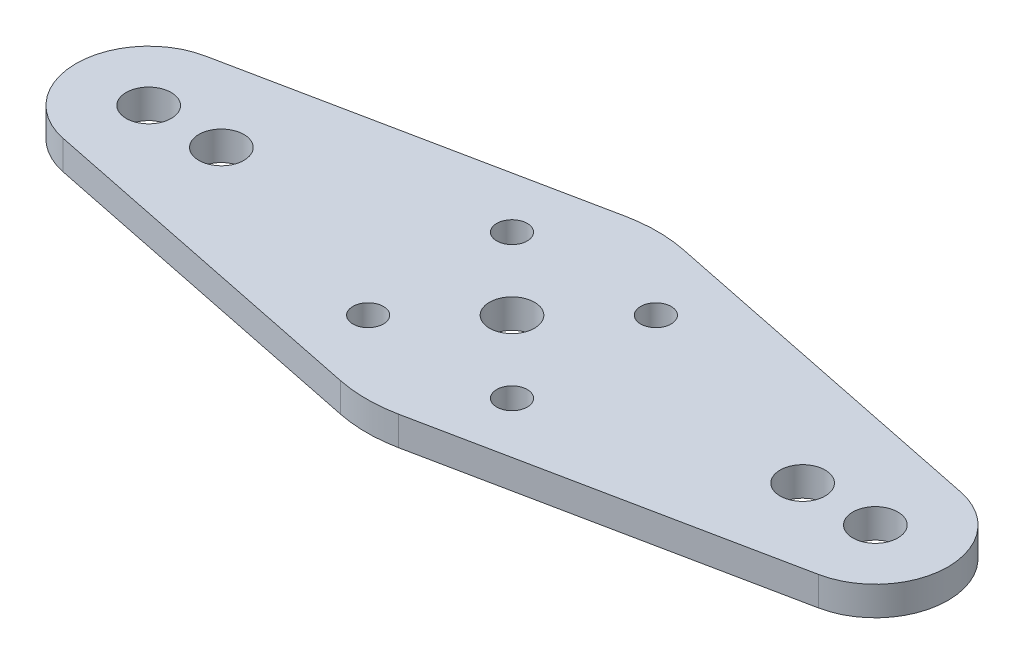
ISO-10303-21;
HEADER;
FILE_DESCRIPTION(('STEP AP214'),'2;1');
FILE_NAME('part.step','',(''),(''),'','','');
FILE_SCHEMA(('AUTOMOTIVE_DESIGN { 1 0 10303 214 1 1 1 1 }'));
ENDSEC;
DATA;
#1=APPLICATION_CONTEXT('core data for automotive mechanical design processes');
#2=APPLICATION_PROTOCOL_DEFINITION('international standard','automotive_design',2000,#1);
#3=PRODUCT_CONTEXT('',#1,'mechanical');
#4=PRODUCT('Part','Part','',(#3));
#5=PRODUCT_RELATED_PRODUCT_CATEGORY('part','',(#4));
#6=PRODUCT_DEFINITION_FORMATION('','',#4);
#7=PRODUCT_DEFINITION_CONTEXT('part definition',#1,'design');
#8=PRODUCT_DEFINITION('design','',#6,#7);
#9=PRODUCT_DEFINITION_SHAPE('','',#8);
#10=(LENGTH_UNIT() NAMED_UNIT(*) SI_UNIT(.MILLI.,.METRE.));
#11=(NAMED_UNIT(*) PLANE_ANGLE_UNIT() SI_UNIT($,.RADIAN.));
#12=(NAMED_UNIT(*) SI_UNIT($,.STERADIAN.) SOLID_ANGLE_UNIT());
#13=UNCERTAINTY_MEASURE_WITH_UNIT(LENGTH_MEASURE(1.E-05),#10,'distance_accuracy_value','');
#14=(GEOMETRIC_REPRESENTATION_CONTEXT(3) GLOBAL_UNCERTAINTY_ASSIGNED_CONTEXT((#13)) GLOBAL_UNIT_ASSIGNED_CONTEXT((#10,
#11,#12)) REPRESENTATION_CONTEXT('',''));
#15=CARTESIAN_POINT('',(0.,0.,0.));
#16=DIRECTION('',(0.,0.,1.));
#17=DIRECTION('',(1.,0.,0.));
#18=AXIS2_PLACEMENT_3D('',#15,#16,#17);
#19=CARTESIAN_POINT('',(0.,-4.,0.));
#20=DIRECTION('',(0.,1.,0.));
#21=DIRECTION('',(0.,0.,1.));
#22=AXIS2_PLACEMENT_3D('',#19,#20,#21);
#23=CYLINDRICAL_SURFACE('',#22,20.);
#24=CARTESIAN_POINT('',(0.,0.,0.));
#25=DIRECTION('',(0.,1.,0.));
#26=DIRECTION('',(0.,0.,1.));
#27=AXIS2_PLACEMENT_3D('',#24,#25,#26);
#28=CIRCLE('',#27,20.);
#29=CARTESIAN_POINT('',(-3.99999999999999,0.,19.5959179422654));
#30=VERTEX_POINT('',#29);
#31=CARTESIAN_POINT('',(4.,0.,19.5959179422654));
#32=VERTEX_POINT('',#31);
#33=EDGE_CURVE('E140',#30,#32,#28,.T.);
#34=ORIENTED_EDGE('',*,*,#33,.F.);
#35=DIRECTION('',(0.,1.,0.));
#36=VECTOR('',#35,1.);
#37=CARTESIAN_POINT('',(-3.99999999999999,-4.,19.5959179422654));
#38=LINE('',#37,#36);
#39=CARTESIAN_POINT('',(-3.99999999999999,-4.,19.5959179422654));
#40=VERTEX_POINT('',#39);
#41=EDGE_CURVE('E11',#40,#30,#38,.T.);
#42=ORIENTED_EDGE('',*,*,#41,.F.);
#43=CARTESIAN_POINT('',(0.,-4.,0.));
#44=DIRECTION('',(0.,1.,0.));
#45=DIRECTION('',(0.,0.,1.));
#46=AXIS2_PLACEMENT_3D('',#43,#44,#45);
#47=CIRCLE('',#46,20.);
#48=CARTESIAN_POINT('',(4.,-4.,19.5959179422654));
#49=VERTEX_POINT('',#48);
#50=EDGE_CURVE('E161',#40,#49,#47,.T.);
#51=ORIENTED_EDGE('',*,*,#50,.T.);
#52=DIRECTION('',(0.,1.,0.));
#53=VECTOR('',#52,1.);
#54=CARTESIAN_POINT('',(4.,-4.,19.5959179422654));
#55=LINE('',#54,#53);
#56=EDGE_CURVE('E46',#49,#32,#55,.T.);
#57=ORIENTED_EDGE('',*,*,#56,.T.);
#58=EDGE_LOOP('',(#34,#42,#51,#57));
#59=FACE_BOUND('',#58,.T.);
#60=ADVANCED_FACE('F43',(#59),#23,.T.);
#61=CARTESIAN_POINT('',(-3.99999999999999,-4.,19.5959179422654));
#62=DIRECTION('',(-0.2,0.,0.979795897113271));
#63=DIRECTION('',(0.979795897113271,0.,0.2));
#64=AXIS2_PLACEMENT_3D('',#61,#62,#63);
#65=PLANE('',#64);
#66=DIRECTION('',(0.979795897113271,0.,0.2));
#67=VECTOR('',#66,1.);
#68=CARTESIAN_POINT('',(-3.99999999999999,0.,19.5959179422654));
#69=LINE('',#68,#67);
#70=CARTESIAN_POINT('',(-52.,0.,9.79795897113274));
#71=VERTEX_POINT('',#70);
#72=EDGE_CURVE('E159',#71,#30,#69,.T.);
#73=ORIENTED_EDGE('',*,*,#72,.F.);
#74=DIRECTION('',(0.,1.,0.));
#75=VECTOR('',#74,1.);
#76=CARTESIAN_POINT('',(-52.,-4.,9.79795897113274));
#77=LINE('',#76,#75);
#78=CARTESIAN_POINT('',(-52.,-4.,9.79795897113274));
#79=VERTEX_POINT('',#78);
#80=EDGE_CURVE('E52',#79,#71,#77,.T.);
#81=ORIENTED_EDGE('',*,*,#80,.F.);
#82=DIRECTION('',(0.979795897113271,0.,0.2));
#83=VECTOR('',#82,1.);
#84=CARTESIAN_POINT('',(-3.99999999999999,-4.,19.5959179422654));
#85=LINE('',#84,#83);
#86=EDGE_CURVE('E130',#79,#40,#85,.T.);
#87=ORIENTED_EDGE('',*,*,#86,.T.);
#88=ORIENTED_EDGE('',*,*,#41,.T.);
#89=EDGE_LOOP('',(#73,#81,#87,#88));
#90=FACE_BOUND('',#89,.T.);
#91=ADVANCED_FACE('F173',(#90),#65,.T.);
#92=CARTESIAN_POINT('',(-50.,-4.,0.));
#93=DIRECTION('',(0.,1.,0.));
#94=DIRECTION('',(0.,0.,1.));
#95=AXIS2_PLACEMENT_3D('',#92,#93,#94);
#96=CYLINDRICAL_SURFACE('',#95,10.);
#97=CARTESIAN_POINT('',(-50.,0.,0.));
#98=DIRECTION('',(0.,1.,0.));
#99=DIRECTION('',(0.,0.,1.));
#100=AXIS2_PLACEMENT_3D('',#97,#98,#99);
#101=CIRCLE('',#100,10.);
#102=CARTESIAN_POINT('',(-52.,0.,-9.79795897113273));
#103=VERTEX_POINT('',#102);
#104=EDGE_CURVE('E117',#103,#71,#101,.T.);
#105=ORIENTED_EDGE('',*,*,#104,.F.);
#106=DIRECTION('',(0.,1.,0.));
#107=VECTOR('',#106,1.);
#108=CARTESIAN_POINT('',(-52.,-4.,-9.79795897113273));
#109=LINE('',#108,#107);
#110=CARTESIAN_POINT('',(-52.,-4.,-9.79795897113273));
#111=VERTEX_POINT('',#110);
#112=EDGE_CURVE('E112',#111,#103,#109,.T.);
#113=ORIENTED_EDGE('',*,*,#112,.F.);
#114=CARTESIAN_POINT('',(-50.,-4.,0.));
#115=DIRECTION('',(0.,1.,0.));
#116=DIRECTION('',(0.,0.,1.));
#117=AXIS2_PLACEMENT_3D('',#114,#115,#116);
#118=CIRCLE('',#117,10.);
#119=EDGE_CURVE('E115',#111,#79,#118,.T.);
#120=ORIENTED_EDGE('',*,*,#119,.T.);
#121=ORIENTED_EDGE('',*,*,#80,.T.);
#122=EDGE_LOOP('',(#105,#113,#120,#121));
#123=FACE_BOUND('',#122,.T.);
#124=ADVANCED_FACE('F114',(#123),#96,.T.);
#125=CARTESIAN_POINT('',(-52.,-4.,-9.79795897113273));
#126=DIRECTION('',(-0.2,0.,-0.979795897113271));
#127=DIRECTION('',(-0.979795897113271,0.,0.2));
#128=AXIS2_PLACEMENT_3D('',#125,#126,#127);
#129=PLANE('',#128);
#130=DIRECTION('',(-0.979795897113271,0.,0.2));
#131=VECTOR('',#130,1.);
#132=CARTESIAN_POINT('',(-52.,0.,-9.79795897113273));
#133=LINE('',#132,#131);
#134=CARTESIAN_POINT('',(-3.99999999999999,0.,-19.5959179422654));
#135=VERTEX_POINT('',#134);
#136=EDGE_CURVE('E156',#135,#103,#133,.T.);
#137=ORIENTED_EDGE('',*,*,#136,.F.);
#138=DIRECTION('',(0.,1.,0.));
#139=VECTOR('',#138,1.);
#140=CARTESIAN_POINT('',(-3.99999999999999,-4.,-19.5959179422654));
#141=LINE('',#140,#139);
#142=CARTESIAN_POINT('',(-3.99999999999999,-4.,-19.5959179422654));
#143=VERTEX_POINT('',#142);
#144=EDGE_CURVE('E122',#143,#135,#141,.T.);
#145=ORIENTED_EDGE('',*,*,#144,.F.);
#146=DIRECTION('',(-0.979795897113271,0.,0.2));
#147=VECTOR('',#146,1.);
#148=CARTESIAN_POINT('',(-52.,-4.,-9.79795897113273));
#149=LINE('',#148,#147);
#150=EDGE_CURVE('E128',#143,#111,#149,.T.);
#151=ORIENTED_EDGE('',*,*,#150,.T.);
#152=ORIENTED_EDGE('',*,*,#112,.T.);
#153=EDGE_LOOP('',(#137,#145,#151,#152));
#154=FACE_BOUND('',#153,.T.);
#155=ADVANCED_FACE('F132',(#154),#129,.T.);
#156=CARTESIAN_POINT('',(0.,-4.,0.));
#157=DIRECTION('',(0.,1.,0.));
#158=DIRECTION('',(0.,0.,1.));
#159=AXIS2_PLACEMENT_3D('',#156,#157,#158);
#160=CYLINDRICAL_SURFACE('',#159,20.);
#161=CARTESIAN_POINT('',(0.,0.,0.));
#162=DIRECTION('',(0.,1.,0.));
#163=DIRECTION('',(0.,0.,1.));
#164=AXIS2_PLACEMENT_3D('',#161,#162,#163);
#165=CIRCLE('',#164,20.);
#166=CARTESIAN_POINT('',(4.,0.,-19.5959179422654));
#167=VERTEX_POINT('',#166);
#168=EDGE_CURVE('E153',#167,#135,#165,.T.);
#169=ORIENTED_EDGE('',*,*,#168,.F.);
#170=DIRECTION('',(0.,1.,0.));
#171=VECTOR('',#170,1.);
#172=CARTESIAN_POINT('',(4.,-4.,-19.5959179422654));
#173=LINE('',#172,#171);
#174=CARTESIAN_POINT('',(4.,-4.,-19.5959179422654));
#175=VERTEX_POINT('',#174);
#176=EDGE_CURVE('E165',#175,#167,#173,.T.);
#177=ORIENTED_EDGE('',*,*,#176,.F.);
#178=CARTESIAN_POINT('',(0.,-4.,0.));
#179=DIRECTION('',(0.,1.,0.));
#180=DIRECTION('',(0.,0.,1.));
#181=AXIS2_PLACEMENT_3D('',#178,#179,#180);
#182=CIRCLE('',#181,20.);
#183=EDGE_CURVE('E133',#175,#143,#182,.T.);
#184=ORIENTED_EDGE('',*,*,#183,.T.);
#185=ORIENTED_EDGE('',*,*,#144,.T.);
#186=EDGE_LOOP('',(#169,#177,#184,#185));
#187=FACE_BOUND('',#186,.T.);
#188=ADVANCED_FACE('F186',(#187),#160,.T.);
#189=CARTESIAN_POINT('',(4.,-4.,-19.5959179422654));
#190=DIRECTION('',(0.2,0.,-0.979795897113271));
#191=DIRECTION('',(-0.979795897113271,0.,-0.2));
#192=AXIS2_PLACEMENT_3D('',#189,#190,#191);
#193=PLANE('',#192);
#194=DIRECTION('',(-0.979795897113271,0.,-0.2));
#195=VECTOR('',#194,1.);
#196=CARTESIAN_POINT('',(4.,0.,-19.5959179422654));
#197=LINE('',#196,#195);
#198=CARTESIAN_POINT('',(52.,0.,-9.79795897113273));
#199=VERTEX_POINT('',#198);
#200=EDGE_CURVE('E150',#199,#167,#197,.T.);
#201=ORIENTED_EDGE('',*,*,#200,.F.);
#202=DIRECTION('',(0.,1.,0.));
#203=VECTOR('',#202,1.);
#204=CARTESIAN_POINT('',(52.,-4.,-9.79795897113273));
#205=LINE('',#204,#203);
#206=CARTESIAN_POINT('',(52.,-4.,-9.79795897113273));
#207=VERTEX_POINT('',#206);
#208=EDGE_CURVE('E167',#207,#199,#205,.T.);
#209=ORIENTED_EDGE('',*,*,#208,.F.);
#210=DIRECTION('',(-0.979795897113271,0.,-0.2));
#211=VECTOR('',#210,1.);
#212=CARTESIAN_POINT('',(4.,-4.,-19.5959179422654));
#213=LINE('',#212,#211);
#214=EDGE_CURVE('E135',#207,#175,#213,.T.);
#215=ORIENTED_EDGE('',*,*,#214,.T.);
#216=ORIENTED_EDGE('',*,*,#176,.T.);
#217=EDGE_LOOP('',(#201,#209,#215,#216));
#218=FACE_BOUND('',#217,.T.);
#219=ADVANCED_FACE('F189',(#218),#193,.T.);
#220=CARTESIAN_POINT('',(50.,-4.,0.));
#221=DIRECTION('',(0.,1.,0.));
#222=DIRECTION('',(0.,0.,1.));
#223=AXIS2_PLACEMENT_3D('',#220,#221,#222);
#224=CYLINDRICAL_SURFACE('',#223,10.);
#225=CARTESIAN_POINT('',(50.,0.,0.));
#226=DIRECTION('',(0.,1.,0.));
#227=DIRECTION('',(0.,0.,1.));
#228=AXIS2_PLACEMENT_3D('',#225,#226,#227);
#229=CIRCLE('',#228,10.);
#230=CARTESIAN_POINT('',(52.,0.,9.79795897113273));
#231=VERTEX_POINT('',#230);
#232=EDGE_CURVE('E147',#231,#199,#229,.T.);
#233=ORIENTED_EDGE('',*,*,#232,.F.);
#234=DIRECTION('',(0.,1.,0.));
#235=VECTOR('',#234,1.);
#236=CARTESIAN_POINT('',(52.,-4.,9.79795897113273));
#237=LINE('',#236,#235);
#238=CARTESIAN_POINT('',(52.,-4.,9.79795897113273));
#239=VERTEX_POINT('',#238);
#240=EDGE_CURVE('E168',#239,#231,#237,.T.);
#241=ORIENTED_EDGE('',*,*,#240,.F.);
#242=CARTESIAN_POINT('',(50.,-4.,0.));
#243=DIRECTION('',(0.,1.,0.));
#244=DIRECTION('',(0.,0.,1.));
#245=AXIS2_PLACEMENT_3D('',#242,#243,#244);
#246=CIRCLE('',#245,10.);
#247=EDGE_CURVE('E305',#239,#207,#246,.T.);
#248=ORIENTED_EDGE('',*,*,#247,.T.);
#249=ORIENTED_EDGE('',*,*,#208,.T.);
#250=EDGE_LOOP('',(#233,#241,#248,#249));
#251=FACE_BOUND('',#250,.T.);
#252=ADVANCED_FACE('F193',(#251),#224,.T.);
#253=CARTESIAN_POINT('',(52.,-4.,9.79795897113273));
#254=DIRECTION('',(0.2,0.,0.979795897113271));
#255=DIRECTION('',(0.979795897113271,0.,-0.2));
#256=AXIS2_PLACEMENT_3D('',#253,#254,#255);
#257=PLANE('',#256);
#258=DIRECTION('',(0.979795897113271,0.,-0.2));
#259=VECTOR('',#258,1.);
#260=CARTESIAN_POINT('',(52.,0.,9.79795897113273));
#261=LINE('',#260,#259);
#262=EDGE_CURVE('E143',#32,#231,#261,.T.);
#263=ORIENTED_EDGE('',*,*,#262,.F.);
#264=ORIENTED_EDGE('',*,*,#56,.F.);
#265=DIRECTION('',(0.979795897113271,0.,-0.2));
#266=VECTOR('',#265,1.);
#267=CARTESIAN_POINT('',(52.,-4.,9.79795897113273));
#268=LINE('',#267,#266);
#269=EDGE_CURVE('E303',#49,#239,#268,.T.);
#270=ORIENTED_EDGE('',*,*,#269,.T.);
#271=ORIENTED_EDGE('',*,*,#240,.T.);
#272=EDGE_LOOP('',(#263,#264,#270,#271));
#273=FACE_BOUND('',#272,.T.);
#274=ADVANCED_FACE('F170',(#273),#257,.T.);
#275=CARTESIAN_POINT('',(0.,-4.,0.));
#276=DIRECTION('',(0.,1.,0.));
#277=DIRECTION('',(0.,0.,1.));
#278=AXIS2_PLACEMENT_3D('',#275,#276,#277);
#279=PLANE('',#278);
#280=CARTESIAN_POINT('',(0.,-4.,0.));
#281=DIRECTION('',(0.,1.,0.));
#282=DIRECTION('',(0.,0.,1.));
#283=AXIS2_PLACEMENT_3D('',#280,#281,#282);
#284=CIRCLE('',#283,3.1);
#285=CARTESIAN_POINT('',(0.,-4.,3.1));
#286=VERTEX_POINT('',#285);
#287=EDGE_CURVE('E251',#286,#286,#284,.T.);
#288=ORIENTED_EDGE('',*,*,#287,.T.);
#289=EDGE_LOOP('',(#288));
#290=FACE_BOUND('',#289,.T.);
#291=CARTESIAN_POINT('',(40.,-4.,0.));
#292=DIRECTION('',(0.,1.,0.));
#293=DIRECTION('',(0.,0.,1.));
#294=AXIS2_PLACEMENT_3D('',#291,#292,#293);
#295=CIRCLE('',#294,3.1);
#296=CARTESIAN_POINT('',(40.,-4.,3.1));
#297=VERTEX_POINT('',#296);
#298=EDGE_CURVE('E255',#297,#297,#295,.T.);
#299=ORIENTED_EDGE('',*,*,#298,.T.);
#300=EDGE_LOOP('',(#299));
#301=FACE_BOUND('',#300,.T.);
#302=CARTESIAN_POINT('',(-50.,-4.,0.));
#303=DIRECTION('',(0.,1.,0.));
#304=DIRECTION('',(0.,0.,1.));
#305=AXIS2_PLACEMENT_3D('',#302,#303,#304);
#306=CIRCLE('',#305,3.1);
#307=CARTESIAN_POINT('',(-50.,-4.,3.1));
#308=VERTEX_POINT('',#307);
#309=EDGE_CURVE('E262',#308,#308,#306,.T.);
#310=ORIENTED_EDGE('',*,*,#309,.T.);
#311=EDGE_LOOP('',(#310));
#312=FACE_BOUND('',#311,.T.);
#313=CARTESIAN_POINT('',(-9.89949493661197,-4.,-9.89949493661137));
#314=DIRECTION('',(0.,1.,0.));
#315=DIRECTION('',(0.,0.,1.));
#316=AXIS2_PLACEMENT_3D('',#313,#314,#315);
#317=CIRCLE('',#316,2.1);
#318=CARTESIAN_POINT('',(-9.89949493661197,-4.,-7.79949493661137));
#319=VERTEX_POINT('',#318);
#320=EDGE_CURVE('E268',#319,#319,#317,.T.);
#321=ORIENTED_EDGE('',*,*,#320,.T.);
#322=EDGE_LOOP('',(#321));
#323=FACE_BOUND('',#322,.T.);
#324=CARTESIAN_POINT('',(-9.89949493661137,-4.,9.89949493661197));
#325=DIRECTION('',(0.,1.,0.));
#326=DIRECTION('',(0.,0.,1.));
#327=AXIS2_PLACEMENT_3D('',#324,#325,#326);
#328=CIRCLE('',#327,2.1);
#329=CARTESIAN_POINT('',(-9.89949493661137,-4.,11.999494936612));
#330=VERTEX_POINT('',#329);
#331=EDGE_CURVE('E274',#330,#330,#328,.T.);
#332=ORIENTED_EDGE('',*,*,#331,.T.);
#333=EDGE_LOOP('',(#332));
#334=FACE_BOUND('',#333,.T.);
#335=CARTESIAN_POINT('',(9.89949493661196,-4.,9.89949493661137));
#336=DIRECTION('',(0.,1.,0.));
#337=DIRECTION('',(0.,0.,1.));
#338=AXIS2_PLACEMENT_3D('',#335,#336,#337);
#339=CIRCLE('',#338,2.09999999999999);
#340=CARTESIAN_POINT('',(9.89949493661196,-4.,11.9994949366114));
#341=VERTEX_POINT('',#340);
#342=EDGE_CURVE('E280',#341,#341,#339,.T.);
#343=ORIENTED_EDGE('',*,*,#342,.T.);
#344=EDGE_LOOP('',(#343));
#345=FACE_BOUND('',#344,.T.);
#346=CARTESIAN_POINT('',(50.,-4.,0.));
#347=DIRECTION('',(0.,1.,0.));
#348=DIRECTION('',(0.,0.,1.));
#349=AXIS2_PLACEMENT_3D('',#346,#347,#348);
#350=CIRCLE('',#349,3.09999999999997);
#351=CARTESIAN_POINT('',(50.,-4.,3.09999999999997));
#352=VERTEX_POINT('',#351);
#353=EDGE_CURVE('E286',#352,#352,#350,.T.);
#354=ORIENTED_EDGE('',*,*,#353,.T.);
#355=EDGE_LOOP('',(#354));
#356=FACE_BOUND('',#355,.T.);
#357=CARTESIAN_POINT('',(9.89949493661137,-4.,-9.89949493661196));
#358=DIRECTION('',(0.,1.,0.));
#359=DIRECTION('',(0.,0.,1.));
#360=AXIS2_PLACEMENT_3D('',#357,#358,#359);
#361=CIRCLE('',#360,2.1);
#362=CARTESIAN_POINT('',(9.89949493661137,-4.,-7.79949493661197));
#363=VERTEX_POINT('',#362);
#364=EDGE_CURVE('E292',#363,#363,#361,.T.);
#365=ORIENTED_EDGE('',*,*,#364,.T.);
#366=EDGE_LOOP('',(#365));
#367=FACE_BOUND('',#366,.T.);
#368=CARTESIAN_POINT('',(-40.,-4.,0.));
#369=DIRECTION('',(0.,1.,0.));
#370=DIRECTION('',(0.,0.,1.));
#371=AXIS2_PLACEMENT_3D('',#368,#369,#370);
#372=CIRCLE('',#371,3.1);
#373=CARTESIAN_POINT('',(-40.,-4.,3.1));
#374=VERTEX_POINT('',#373);
#375=EDGE_CURVE('E144',#374,#374,#372,.T.);
#376=ORIENTED_EDGE('',*,*,#375,.T.);
#377=EDGE_LOOP('',(#376));
#378=FACE_BOUND('',#377,.T.);
#379=ORIENTED_EDGE('',*,*,#50,.F.);
#380=ORIENTED_EDGE('',*,*,#86,.F.);
#381=ORIENTED_EDGE('',*,*,#119,.F.);
#382=ORIENTED_EDGE('',*,*,#150,.F.);
#383=ORIENTED_EDGE('',*,*,#183,.F.);
#384=ORIENTED_EDGE('',*,*,#214,.F.);
#385=ORIENTED_EDGE('',*,*,#247,.F.);
#386=ORIENTED_EDGE('',*,*,#269,.F.);
#387=EDGE_LOOP('',(#379,#380,#381,#382,#383,#384,#385,#386));
#388=FACE_BOUND('',#387,.T.);
#389=ADVANCED_FACE('F126',(#290,#301,#312,#323,#334,#345,#356,#367,#378,#388),#279,.F.);
#390=CARTESIAN_POINT('',(0.,0.,0.));
#391=DIRECTION('',(0.,1.,0.));
#392=DIRECTION('',(0.,0.,1.));
#393=AXIS2_PLACEMENT_3D('',#390,#391,#392);
#394=PLANE('',#393);
#395=CARTESIAN_POINT('',(0.,0.,0.));
#396=DIRECTION('',(0.,1.,0.));
#397=DIRECTION('',(0.,0.,1.));
#398=AXIS2_PLACEMENT_3D('',#395,#396,#397);
#399=CIRCLE('',#398,3.1);
#400=CARTESIAN_POINT('',(0.,0.,3.1));
#401=VERTEX_POINT('',#400);
#402=EDGE_CURVE('E249',#401,#401,#399,.T.);
#403=ORIENTED_EDGE('',*,*,#402,.F.);
#404=EDGE_LOOP('',(#403));
#405=FACE_BOUND('',#404,.T.);
#406=CARTESIAN_POINT('',(40.,0.,0.));
#407=DIRECTION('',(0.,1.,0.));
#408=DIRECTION('',(0.,0.,1.));
#409=AXIS2_PLACEMENT_3D('',#406,#407,#408);
#410=CIRCLE('',#409,3.1);
#411=CARTESIAN_POINT('',(40.,0.,3.1));
#412=VERTEX_POINT('',#411);
#413=EDGE_CURVE('E252',#412,#412,#410,.T.);
#414=ORIENTED_EDGE('',*,*,#413,.F.);
#415=EDGE_LOOP('',(#414));
#416=FACE_BOUND('',#415,.T.);
#417=CARTESIAN_POINT('',(-50.,0.,0.));
#418=DIRECTION('',(0.,1.,0.));
#419=DIRECTION('',(0.,0.,1.));
#420=AXIS2_PLACEMENT_3D('',#417,#418,#419);
#421=CIRCLE('',#420,3.1);
#422=CARTESIAN_POINT('',(-50.,0.,3.1));
#423=VERTEX_POINT('',#422);
#424=EDGE_CURVE('E260',#423,#423,#421,.T.);
#425=ORIENTED_EDGE('',*,*,#424,.F.);
#426=EDGE_LOOP('',(#425));
#427=FACE_BOUND('',#426,.T.);
#428=CARTESIAN_POINT('',(-9.89949493661197,0.,-9.89949493661137));
#429=DIRECTION('',(0.,1.,0.));
#430=DIRECTION('',(0.,0.,1.));
#431=AXIS2_PLACEMENT_3D('',#428,#429,#430);
#432=CIRCLE('',#431,2.1);
#433=CARTESIAN_POINT('',(-9.89949493661197,0.,-7.79949493661137));
#434=VERTEX_POINT('',#433);
#435=EDGE_CURVE('E265',#434,#434,#432,.T.);
#436=ORIENTED_EDGE('',*,*,#435,.F.);
#437=EDGE_LOOP('',(#436));
#438=FACE_BOUND('',#437,.T.);
#439=CARTESIAN_POINT('',(-9.89949493661137,0.,9.89949493661197));
#440=DIRECTION('',(0.,1.,0.));
#441=DIRECTION('',(0.,0.,1.));
#442=AXIS2_PLACEMENT_3D('',#439,#440,#441);
#443=CIRCLE('',#442,2.1);
#444=CARTESIAN_POINT('',(-9.89949493661137,0.,11.999494936612));
#445=VERTEX_POINT('',#444);
#446=EDGE_CURVE('E271',#445,#445,#443,.T.);
#447=ORIENTED_EDGE('',*,*,#446,.F.);
#448=EDGE_LOOP('',(#447));
#449=FACE_BOUND('',#448,.T.);
#450=CARTESIAN_POINT('',(9.89949493661196,0.,9.89949493661137));
#451=DIRECTION('',(0.,1.,0.));
#452=DIRECTION('',(0.,0.,1.));
#453=AXIS2_PLACEMENT_3D('',#450,#451,#452);
#454=CIRCLE('',#453,2.09999999999999);
#455=CARTESIAN_POINT('',(9.89949493661196,0.,11.9994949366114));
#456=VERTEX_POINT('',#455);
#457=EDGE_CURVE('E277',#456,#456,#454,.T.);
#458=ORIENTED_EDGE('',*,*,#457,.F.);
#459=EDGE_LOOP('',(#458));
#460=FACE_BOUND('',#459,.T.);
#461=CARTESIAN_POINT('',(50.,0.,0.));
#462=DIRECTION('',(0.,1.,0.));
#463=DIRECTION('',(0.,0.,1.));
#464=AXIS2_PLACEMENT_3D('',#461,#462,#463);
#465=CIRCLE('',#464,3.09999999999997);
#466=CARTESIAN_POINT('',(50.,0.,3.09999999999997));
#467=VERTEX_POINT('',#466);
#468=EDGE_CURVE('E283',#467,#467,#465,.T.);
#469=ORIENTED_EDGE('',*,*,#468,.F.);
#470=EDGE_LOOP('',(#469));
#471=FACE_BOUND('',#470,.T.);
#472=CARTESIAN_POINT('',(9.89949493661137,0.,-9.89949493661196));
#473=DIRECTION('',(0.,1.,0.));
#474=DIRECTION('',(0.,0.,1.));
#475=AXIS2_PLACEMENT_3D('',#472,#473,#474);
#476=CIRCLE('',#475,2.1);
#477=CARTESIAN_POINT('',(9.89949493661137,0.,-7.79949493661197));
#478=VERTEX_POINT('',#477);
#479=EDGE_CURVE('E289',#478,#478,#476,.T.);
#480=ORIENTED_EDGE('',*,*,#479,.F.);
#481=EDGE_LOOP('',(#480));
#482=FACE_BOUND('',#481,.T.);
#483=CARTESIAN_POINT('',(-40.,0.,0.));
#484=DIRECTION('',(0.,1.,0.));
#485=DIRECTION('',(0.,0.,1.));
#486=AXIS2_PLACEMENT_3D('',#483,#484,#485);
#487=CIRCLE('',#486,3.1);
#488=CARTESIAN_POINT('',(-40.,0.,3.1));
#489=VERTEX_POINT('',#488);
#490=EDGE_CURVE('E295',#489,#489,#487,.T.);
#491=ORIENTED_EDGE('',*,*,#490,.F.);
#492=EDGE_LOOP('',(#491));
#493=FACE_BOUND('',#492,.T.);
#494=ORIENTED_EDGE('',*,*,#33,.T.);
#495=ORIENTED_EDGE('',*,*,#262,.T.);
#496=ORIENTED_EDGE('',*,*,#232,.T.);
#497=ORIENTED_EDGE('',*,*,#200,.T.);
#498=ORIENTED_EDGE('',*,*,#168,.T.);
#499=ORIENTED_EDGE('',*,*,#136,.T.);
#500=ORIENTED_EDGE('',*,*,#104,.T.);
#501=ORIENTED_EDGE('',*,*,#72,.T.);
#502=EDGE_LOOP('',(#494,#495,#496,#497,#498,#499,#500,#501));
#503=FACE_BOUND('',#502,.T.);
#504=ADVANCED_FACE('F172',(#405,#416,#427,#438,#449,#460,#471,#482,#493,#503),#394,.T.);
#505=CARTESIAN_POINT('',(-40.,-4.,0.));
#506=DIRECTION('',(0.,1.,0.));
#507=DIRECTION('',(0.,0.,1.));
#508=AXIS2_PLACEMENT_3D('',#505,#506,#507);
#509=CYLINDRICAL_SURFACE('',#508,3.1);
#510=ORIENTED_EDGE('',*,*,#375,.F.);
#511=EDGE_LOOP('',(#510));
#512=FACE_BOUND('',#511,.T.);
#513=ORIENTED_EDGE('',*,*,#490,.T.);
#514=EDGE_LOOP('',(#513));
#515=FACE_BOUND('',#514,.T.);
#516=ADVANCED_FACE('F205',(#512,#515),#509,.F.);
#517=CARTESIAN_POINT('',(9.89949493661137,-4.,-9.89949493661196));
#518=DIRECTION('',(0.,1.,0.));
#519=DIRECTION('',(0.,0.,1.));
#520=AXIS2_PLACEMENT_3D('',#517,#518,#519);
#521=CYLINDRICAL_SURFACE('',#520,2.1);
#522=ORIENTED_EDGE('',*,*,#364,.F.);
#523=EDGE_LOOP('',(#522));
#524=FACE_BOUND('',#523,.T.);
#525=ORIENTED_EDGE('',*,*,#479,.T.);
#526=EDGE_LOOP('',(#525));
#527=FACE_BOUND('',#526,.T.);
#528=ADVANCED_FACE('F212',(#524,#527),#521,.F.);
#529=CARTESIAN_POINT('',(50.,-4.,0.));
#530=DIRECTION('',(0.,1.,0.));
#531=DIRECTION('',(0.,0.,1.));
#532=AXIS2_PLACEMENT_3D('',#529,#530,#531);
#533=CYLINDRICAL_SURFACE('',#532,3.09999999999997);
#534=ORIENTED_EDGE('',*,*,#353,.F.);
#535=EDGE_LOOP('',(#534));
#536=FACE_BOUND('',#535,.T.);
#537=ORIENTED_EDGE('',*,*,#468,.T.);
#538=EDGE_LOOP('',(#537));
#539=FACE_BOUND('',#538,.T.);
#540=ADVANCED_FACE('F216',(#536,#539),#533,.F.);
#541=CARTESIAN_POINT('',(9.89949493661196,-4.,9.89949493661137));
#542=DIRECTION('',(0.,1.,0.));
#543=DIRECTION('',(0.,0.,1.));
#544=AXIS2_PLACEMENT_3D('',#541,#542,#543);
#545=CYLINDRICAL_SURFACE('',#544,2.09999999999999);
#546=ORIENTED_EDGE('',*,*,#342,.F.);
#547=EDGE_LOOP('',(#546));
#548=FACE_BOUND('',#547,.T.);
#549=ORIENTED_EDGE('',*,*,#457,.T.);
#550=EDGE_LOOP('',(#549));
#551=FACE_BOUND('',#550,.T.);
#552=ADVANCED_FACE('F220',(#548,#551),#545,.F.);
#553=CARTESIAN_POINT('',(-9.89949493661137,-4.,9.89949493661197));
#554=DIRECTION('',(0.,1.,0.));
#555=DIRECTION('',(0.,0.,1.));
#556=AXIS2_PLACEMENT_3D('',#553,#554,#555);
#557=CYLINDRICAL_SURFACE('',#556,2.1);
#558=ORIENTED_EDGE('',*,*,#331,.F.);
#559=EDGE_LOOP('',(#558));
#560=FACE_BOUND('',#559,.T.);
#561=ORIENTED_EDGE('',*,*,#446,.T.);
#562=EDGE_LOOP('',(#561));
#563=FACE_BOUND('',#562,.T.);
#564=ADVANCED_FACE('F224',(#560,#563),#557,.F.);
#565=CARTESIAN_POINT('',(-9.89949493661197,-4.,-9.89949493661137));
#566=DIRECTION('',(0.,1.,0.));
#567=DIRECTION('',(0.,0.,1.));
#568=AXIS2_PLACEMENT_3D('',#565,#566,#567);
#569=CYLINDRICAL_SURFACE('',#568,2.1);
#570=ORIENTED_EDGE('',*,*,#320,.F.);
#571=EDGE_LOOP('',(#570));
#572=FACE_BOUND('',#571,.T.);
#573=ORIENTED_EDGE('',*,*,#435,.T.);
#574=EDGE_LOOP('',(#573));
#575=FACE_BOUND('',#574,.T.);
#576=ADVANCED_FACE('F228',(#572,#575),#569,.F.);
#577=CARTESIAN_POINT('',(-50.,-4.,0.));
#578=DIRECTION('',(0.,1.,0.));
#579=DIRECTION('',(0.,0.,1.));
#580=AXIS2_PLACEMENT_3D('',#577,#578,#579);
#581=CYLINDRICAL_SURFACE('',#580,3.1);
#582=ORIENTED_EDGE('',*,*,#309,.F.);
#583=EDGE_LOOP('',(#582));
#584=FACE_BOUND('',#583,.T.);
#585=ORIENTED_EDGE('',*,*,#424,.T.);
#586=EDGE_LOOP('',(#585));
#587=FACE_BOUND('',#586,.T.);
#588=ADVANCED_FACE('F232',(#584,#587),#581,.F.);
#589=CARTESIAN_POINT('',(40.,-4.,0.));
#590=DIRECTION('',(0.,1.,0.));
#591=DIRECTION('',(0.,0.,1.));
#592=AXIS2_PLACEMENT_3D('',#589,#590,#591);
#593=CYLINDRICAL_SURFACE('',#592,3.1);
#594=ORIENTED_EDGE('',*,*,#298,.F.);
#595=EDGE_LOOP('',(#594));
#596=FACE_BOUND('',#595,.T.);
#597=ORIENTED_EDGE('',*,*,#413,.T.);
#598=EDGE_LOOP('',(#597));
#599=FACE_BOUND('',#598,.T.);
#600=ADVANCED_FACE('F236',(#596,#599),#593,.F.);
#601=CARTESIAN_POINT('',(0.,-10.,0.));
#602=DIRECTION('',(0.,1.,0.));
#603=DIRECTION('',(0.,0.,1.));
#604=AXIS2_PLACEMENT_3D('',#601,#602,#603);
#605=CYLINDRICAL_SURFACE('',#604,3.1);
#606=ORIENTED_EDGE('',*,*,#402,.T.);
#607=EDGE_LOOP('',(#606));
#608=FACE_BOUND('',#607,.T.);
#609=ORIENTED_EDGE('',*,*,#287,.F.);
#610=EDGE_LOOP('',(#609));
#611=FACE_BOUND('',#610,.T.);
#612=ADVANCED_FACE('F240',(#608,#611),#605,.F.);
#613=CLOSED_SHELL('',(#60,#91,#124,#155,#188,#219,#252,#274,#389,#504,#516,#528,#540,#552,#564,
#576,#588,#600,#612));
#614=MANIFOLD_SOLID_BREP('B2',#613);
#615=ADVANCED_BREP_SHAPE_REPRESENTATION('',(#18,#614),#14);
#616=SHAPE_DEFINITION_REPRESENTATION(#9,#615);
ENDSEC;
END-ISO-10303-21;
